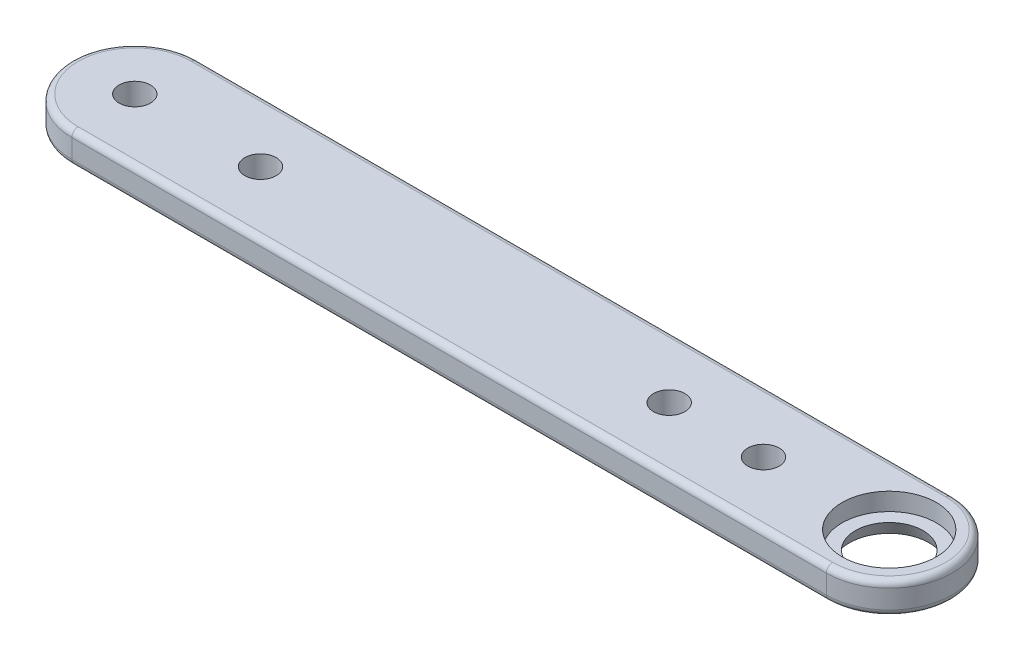
ISO-10303-21;
HEADER;
FILE_DESCRIPTION(('STEP AP214'),'2;1');
FILE_NAME('part.step','',(''),(''),'','','');
FILE_SCHEMA(('AUTOMOTIVE_DESIGN { 1 0 10303 214 1 1 1 1 }'));
ENDSEC;
DATA;
#1=APPLICATION_CONTEXT('core data for automotive mechanical design processes');
#2=APPLICATION_PROTOCOL_DEFINITION('international standard','automotive_design',2000,#1);
#3=PRODUCT_CONTEXT('',#1,'mechanical');
#4=PRODUCT('Part','Part','',(#3));
#5=PRODUCT_RELATED_PRODUCT_CATEGORY('part','',(#4));
#6=PRODUCT_DEFINITION_FORMATION('','',#4);
#7=PRODUCT_DEFINITION_CONTEXT('part definition',#1,'design');
#8=PRODUCT_DEFINITION('design','',#6,#7);
#9=PRODUCT_DEFINITION_SHAPE('','',#8);
#10=(LENGTH_UNIT() NAMED_UNIT(*) SI_UNIT(.MILLI.,.METRE.));
#11=(NAMED_UNIT(*) PLANE_ANGLE_UNIT() SI_UNIT($,.RADIAN.));
#12=(NAMED_UNIT(*) SI_UNIT($,.STERADIAN.) SOLID_ANGLE_UNIT());
#13=UNCERTAINTY_MEASURE_WITH_UNIT(LENGTH_MEASURE(1.E-05),#10,'distance_accuracy_value','');
#14=(GEOMETRIC_REPRESENTATION_CONTEXT(3) GLOBAL_UNCERTAINTY_ASSIGNED_CONTEXT((#13)) GLOBAL_UNIT_ASSIGNED_CONTEXT((#10,
#11,#12)) REPRESENTATION_CONTEXT('',''));
#15=CARTESIAN_POINT('',(0.,0.,0.));
#16=DIRECTION('',(0.,0.,1.));
#17=DIRECTION('',(1.,0.,0.));
#18=AXIS2_PLACEMENT_3D('',#15,#16,#17);
#19=CARTESIAN_POINT('',(0.,6.35,0.));
#20=DIRECTION('',(0.,1.,0.));
#21=DIRECTION('',(0.,0.,1.));
#22=AXIS2_PLACEMENT_3D('',#19,#20,#21);
#23=PLANE('',#22);
#24=CARTESIAN_POINT('',(76.2,6.35,0.));
#25=DIRECTION('',(0.,1.,0.));
#26=DIRECTION('',(0.,0.,1.));
#27=AXIS2_PLACEMENT_3D('',#24,#25,#26);
#28=CIRCLE('',#27,11.43);
#29=CARTESIAN_POINT('',(76.2,6.35,11.43));
#30=VERTEX_POINT('',#29);
#31=CARTESIAN_POINT('',(76.2,6.35,-11.43));
#32=VERTEX_POINT('',#31);
#33=EDGE_CURVE('E61',#30,#32,#28,.T.);
#34=ORIENTED_EDGE('',*,*,#33,.T.);
#35=DIRECTION('',(-1.,0.,0.));
#36=VECTOR('',#35,1.);
#37=CARTESIAN_POINT('',(-76.2,6.35,-11.43));
#38=LINE('',#37,#36);
#39=CARTESIAN_POINT('',(-76.2,6.35,-11.43));
#40=VERTEX_POINT('',#39);
#41=EDGE_CURVE('E56',#32,#40,#38,.T.);
#42=ORIENTED_EDGE('',*,*,#41,.T.);
#43=CARTESIAN_POINT('',(-76.2,6.35,0.));
#44=DIRECTION('',(0.,1.,0.));
#45=DIRECTION('',(0.,0.,1.));
#46=AXIS2_PLACEMENT_3D('',#43,#44,#45);
#47=CIRCLE('',#46,11.43);
#48=CARTESIAN_POINT('',(-76.2,6.35,11.43));
#49=VERTEX_POINT('',#48);
#50=EDGE_CURVE('E163',#40,#49,#47,.T.);
#51=ORIENTED_EDGE('',*,*,#50,.T.);
#52=DIRECTION('',(1.,0.,0.));
#53=VECTOR('',#52,1.);
#54=CARTESIAN_POINT('',(76.2,6.35,11.43));
#55=LINE('',#54,#53);
#56=EDGE_CURVE('E160',#49,#30,#55,.T.);
#57=ORIENTED_EDGE('',*,*,#56,.T.);
#58=EDGE_LOOP('',(#34,#42,#51,#57));
#59=FACE_BOUND('',#58,.T.);
#60=CARTESIAN_POINT('',(50.8,6.35,0.));
#61=DIRECTION('',(0.,1.,0.));
#62=DIRECTION('',(0.,0.,1.));
#63=AXIS2_PLACEMENT_3D('',#60,#61,#62);
#64=CIRCLE('',#63,3.175);
#65=CARTESIAN_POINT('',(50.8,6.35,3.17500000000002));
#66=VERTEX_POINT('',#65);
#67=EDGE_CURVE('E207',#66,#66,#64,.T.);
#68=ORIENTED_EDGE('',*,*,#67,.F.);
#69=EDGE_LOOP('',(#68));
#70=FACE_BOUND('',#69,.T.);
#71=CARTESIAN_POINT('',(31.75,6.35,0.));
#72=DIRECTION('',(0.,1.,0.));
#73=DIRECTION('',(0.,0.,1.));
#74=AXIS2_PLACEMENT_3D('',#71,#72,#73);
#75=CIRCLE('',#74,3.175);
#76=CARTESIAN_POINT('',(31.75,6.35,3.17500000000001));
#77=VERTEX_POINT('',#76);
#78=EDGE_CURVE('E201',#77,#77,#75,.T.);
#79=ORIENTED_EDGE('',*,*,#78,.F.);
#80=EDGE_LOOP('',(#79));
#81=FACE_BOUND('',#80,.T.);
#82=CARTESIAN_POINT('',(76.2,6.35,0.));
#83=DIRECTION('',(0.,1.,0.));
#84=DIRECTION('',(0.,0.,1.));
#85=AXIS2_PLACEMENT_3D('',#82,#83,#84);
#86=CIRCLE('',#85,9.52499999999999);
#87=CARTESIAN_POINT('',(76.2,6.35,9.52499999999999));
#88=VERTEX_POINT('',#87);
#89=EDGE_CURVE('E206',#88,#88,#86,.T.);
#90=ORIENTED_EDGE('',*,*,#89,.F.);
#91=EDGE_LOOP('',(#90));
#92=FACE_BOUND('',#91,.T.);
#93=CARTESIAN_POINT('',(-76.2,6.35,0.));
#94=DIRECTION('',(0.,1.,0.));
#95=DIRECTION('',(0.,0.,1.));
#96=AXIS2_PLACEMENT_3D('',#93,#94,#95);
#97=CIRCLE('',#96,3.175);
#98=CARTESIAN_POINT('',(-76.2,6.35,3.175));
#99=VERTEX_POINT('',#98);
#100=EDGE_CURVE('E223',#99,#99,#97,.T.);
#101=ORIENTED_EDGE('',*,*,#100,.F.);
#102=EDGE_LOOP('',(#101));
#103=FACE_BOUND('',#102,.T.);
#104=CARTESIAN_POINT('',(-50.8,6.35,0.));
#105=DIRECTION('',(0.,1.,0.));
#106=DIRECTION('',(0.,0.,1.));
#107=AXIS2_PLACEMENT_3D('',#104,#105,#106);
#108=CIRCLE('',#107,3.175);
#109=CARTESIAN_POINT('',(-50.8,6.35,3.175));
#110=VERTEX_POINT('',#109);
#111=EDGE_CURVE('E218',#110,#110,#108,.T.);
#112=ORIENTED_EDGE('',*,*,#111,.F.);
#113=EDGE_LOOP('',(#112));
#114=FACE_BOUND('',#113,.T.);
#115=ADVANCED_FACE('F39',(#59,#70,#81,#92,#103,#114),#23,.T.);
#116=CARTESIAN_POINT('',(0.,0.,0.));
#117=DIRECTION('',(0.,1.,0.));
#118=DIRECTION('',(0.,0.,1.));
#119=AXIS2_PLACEMENT_3D('',#116,#117,#118);
#120=PLANE('',#119);
#121=CARTESIAN_POINT('',(76.2,0.,0.));
#122=DIRECTION('',(0.,-1.,0.));
#123=DIRECTION('',(0.,0.,-1.));
#124=AXIS2_PLACEMENT_3D('',#121,#122,#123);
#125=CIRCLE('',#124,8.06821118956803);
#126=CARTESIAN_POINT('',(76.2,0.,-8.06821118956803));
#127=VERTEX_POINT('',#126);
#128=EDGE_CURVE('E417',#127,#127,#125,.T.);
#129=ORIENTED_EDGE('',*,*,#128,.F.);
#130=EDGE_LOOP('',(#129));
#131=FACE_BOUND('',#130,.T.);
#132=CARTESIAN_POINT('',(-76.2,0.,0.));
#133=DIRECTION('',(0.,1.,0.));
#134=DIRECTION('',(0.,0.,1.));
#135=AXIS2_PLACEMENT_3D('',#132,#133,#134);
#136=CIRCLE('',#135,11.43);
#137=CARTESIAN_POINT('',(-76.2,0.,11.43));
#138=VERTEX_POINT('',#137);
#139=CARTESIAN_POINT('',(-76.2,0.,-11.43));
#140=VERTEX_POINT('',#139);
#141=EDGE_CURVE('E153',#138,#140,#136,.F.);
#142=ORIENTED_EDGE('',*,*,#141,.T.);
#143=DIRECTION('',(-1.,0.,0.));
#144=VECTOR('',#143,1.);
#145=CARTESIAN_POINT('',(0.,0.,-11.43));
#146=LINE('',#145,#144);
#147=CARTESIAN_POINT('',(76.2,0.,-11.43));
#148=VERTEX_POINT('',#147);
#149=EDGE_CURVE('E134',#140,#148,#146,.F.);
#150=ORIENTED_EDGE('',*,*,#149,.T.);
#151=CARTESIAN_POINT('',(76.2,0.,0.));
#152=DIRECTION('',(0.,1.,0.));
#153=DIRECTION('',(0.,0.,1.));
#154=AXIS2_PLACEMENT_3D('',#151,#152,#153);
#155=CIRCLE('',#154,11.43);
#156=CARTESIAN_POINT('',(76.2,0.,11.43));
#157=VERTEX_POINT('',#156);
#158=EDGE_CURVE('E146',#148,#157,#155,.F.);
#159=ORIENTED_EDGE('',*,*,#158,.T.);
#160=DIRECTION('',(1.,0.,0.));
#161=VECTOR('',#160,1.);
#162=CARTESIAN_POINT('',(0.,0.,11.43));
#163=LINE('',#162,#161);
#164=EDGE_CURVE('E144',#157,#138,#163,.F.);
#165=ORIENTED_EDGE('',*,*,#164,.T.);
#166=EDGE_LOOP('',(#142,#150,#159,#165));
#167=FACE_BOUND('',#166,.T.);
#168=CARTESIAN_POINT('',(50.8,0.,0.));
#169=DIRECTION('',(0.,1.,0.));
#170=DIRECTION('',(0.,0.,1.));
#171=AXIS2_PLACEMENT_3D('',#168,#169,#170);
#172=CIRCLE('',#171,3.175);
#173=CARTESIAN_POINT('',(50.8,0.,3.17500000000002));
#174=VERTEX_POINT('',#173);
#175=EDGE_CURVE('E203',#174,#174,#172,.T.);
#176=ORIENTED_EDGE('',*,*,#175,.T.);
#177=EDGE_LOOP('',(#176));
#178=FACE_BOUND('',#177,.T.);
#179=CARTESIAN_POINT('',(31.75,0.,0.));
#180=DIRECTION('',(0.,1.,0.));
#181=DIRECTION('',(0.,0.,1.));
#182=AXIS2_PLACEMENT_3D('',#179,#180,#181);
#183=CIRCLE('',#182,3.175);
#184=CARTESIAN_POINT('',(31.75,0.,3.17500000000001));
#185=VERTEX_POINT('',#184);
#186=EDGE_CURVE('E210',#185,#185,#183,.T.);
#187=ORIENTED_EDGE('',*,*,#186,.T.);
#188=EDGE_LOOP('',(#187));
#189=FACE_BOUND('',#188,.T.);
#190=CARTESIAN_POINT('',(-76.2,0.,0.));
#191=DIRECTION('',(0.,1.,0.));
#192=DIRECTION('',(0.,0.,1.));
#193=AXIS2_PLACEMENT_3D('',#190,#191,#192);
#194=CIRCLE('',#193,3.175);
#195=CARTESIAN_POINT('',(-76.2,0.,3.175));
#196=VERTEX_POINT('',#195);
#197=EDGE_CURVE('E148',#196,#196,#194,.T.);
#198=ORIENTED_EDGE('',*,*,#197,.T.);
#199=EDGE_LOOP('',(#198));
#200=FACE_BOUND('',#199,.T.);
#201=CARTESIAN_POINT('',(-50.8,0.,0.));
#202=DIRECTION('',(0.,1.,0.));
#203=DIRECTION('',(0.,0.,1.));
#204=AXIS2_PLACEMENT_3D('',#201,#202,#203);
#205=CIRCLE('',#204,3.175);
#206=CARTESIAN_POINT('',(-50.8,0.,3.175));
#207=VERTEX_POINT('',#206);
#208=EDGE_CURVE('E226',#207,#207,#205,.T.);
#209=ORIENTED_EDGE('',*,*,#208,.T.);
#210=EDGE_LOOP('',(#209));
#211=FACE_BOUND('',#210,.T.);
#212=ADVANCED_FACE('F234',(#131,#167,#178,#189,#200,#211),#120,.F.);
#213=CARTESIAN_POINT('',(88.9,6.35,12.7));
#214=DIRECTION('',(0.,0.,-1.));
#215=DIRECTION('',(-1.,0.,0.));
#216=AXIS2_PLACEMENT_3D('',#213,#214,#215);
#217=PLANE('',#216);
#218=DIRECTION('',(0.,1.,0.));
#219=VECTOR('',#218,1.);
#220=CARTESIAN_POINT('',(-76.2,0.,12.7));
#221=LINE('',#220,#219);
#222=CARTESIAN_POINT('',(-76.2,1.27,12.7));
#223=VERTEX_POINT('',#222);
#224=CARTESIAN_POINT('',(-76.2,5.08,12.7));
#225=VERTEX_POINT('',#224);
#226=EDGE_CURVE('E195',#223,#225,#221,.T.);
#227=ORIENTED_EDGE('',*,*,#226,.F.);
#228=DIRECTION('',(1.,0.,0.));
#229=VECTOR('',#228,1.);
#230=CARTESIAN_POINT('',(88.9,1.27,12.7));
#231=LINE('',#230,#229);
#232=CARTESIAN_POINT('',(76.2,1.27,12.7));
#233=VERTEX_POINT('',#232);
#234=EDGE_CURVE('E12',#223,#233,#231,.T.);
#235=ORIENTED_EDGE('',*,*,#234,.T.);
#236=DIRECTION('',(0.,1.,0.));
#237=VECTOR('',#236,1.);
#238=CARTESIAN_POINT('',(76.2,0.,12.7));
#239=LINE('',#238,#237);
#240=CARTESIAN_POINT('',(76.2,5.08,12.7));
#241=VERTEX_POINT('',#240);
#242=EDGE_CURVE('E128',#233,#241,#239,.T.);
#243=ORIENTED_EDGE('',*,*,#242,.T.);
#244=DIRECTION('',(1.,0.,0.));
#245=VECTOR('',#244,1.);
#246=CARTESIAN_POINT('',(-76.2,5.08,12.7));
#247=LINE('',#246,#245);
#248=EDGE_CURVE('E48',#241,#225,#247,.F.);
#249=ORIENTED_EDGE('',*,*,#248,.T.);
#250=EDGE_LOOP('',(#227,#235,#243,#249));
#251=FACE_BOUND('',#250,.T.);
#252=ADVANCED_FACE('F194',(#251),#217,.F.);
#253=CARTESIAN_POINT('',(88.9,6.35,-12.7));
#254=DIRECTION('',(0.,0.,1.));
#255=DIRECTION('',(1.,0.,0.));
#256=AXIS2_PLACEMENT_3D('',#253,#254,#255);
#257=PLANE('',#256);
#258=DIRECTION('',(0.,1.,0.));
#259=VECTOR('',#258,1.);
#260=CARTESIAN_POINT('',(76.2,0.,-12.7));
#261=LINE('',#260,#259);
#262=CARTESIAN_POINT('',(76.2,1.27,-12.7));
#263=VERTEX_POINT('',#262);
#264=CARTESIAN_POINT('',(76.2,5.08,-12.7));
#265=VERTEX_POINT('',#264);
#266=EDGE_CURVE('E111',#263,#265,#261,.T.);
#267=ORIENTED_EDGE('',*,*,#266,.F.);
#268=DIRECTION('',(-1.,0.,0.));
#269=VECTOR('',#268,1.);
#270=CARTESIAN_POINT('',(88.9,1.27,-12.7));
#271=LINE('',#270,#269);
#272=CARTESIAN_POINT('',(-76.2,1.27,-12.7));
#273=VERTEX_POINT('',#272);
#274=EDGE_CURVE('E106',#263,#273,#271,.T.);
#275=ORIENTED_EDGE('',*,*,#274,.T.);
#276=DIRECTION('',(0.,1.,0.));
#277=VECTOR('',#276,1.);
#278=CARTESIAN_POINT('',(-76.2,0.,-12.7));
#279=LINE('',#278,#277);
#280=CARTESIAN_POINT('',(-76.2,5.08,-12.7));
#281=VERTEX_POINT('',#280);
#282=EDGE_CURVE('E109',#273,#281,#279,.T.);
#283=ORIENTED_EDGE('',*,*,#282,.T.);
#284=DIRECTION('',(-1.,0.,0.));
#285=VECTOR('',#284,1.);
#286=CARTESIAN_POINT('',(76.2,5.08,-12.7));
#287=LINE('',#286,#285);
#288=EDGE_CURVE('E116',#281,#265,#287,.F.);
#289=ORIENTED_EDGE('',*,*,#288,.T.);
#290=EDGE_LOOP('',(#267,#275,#283,#289));
#291=FACE_BOUND('',#290,.T.);
#292=ADVANCED_FACE('F108',(#291),#257,.F.);
#293=CARTESIAN_POINT('',(-50.8,0.,0.));
#294=DIRECTION('',(0.,1.,0.));
#295=DIRECTION('',(0.,0.,1.));
#296=AXIS2_PLACEMENT_3D('',#293,#294,#295);
#297=CYLINDRICAL_SURFACE('',#296,3.175);
#298=ORIENTED_EDGE('',*,*,#208,.F.);
#299=EDGE_LOOP('',(#298));
#300=FACE_BOUND('',#299,.T.);
#301=ORIENTED_EDGE('',*,*,#111,.T.);
#302=EDGE_LOOP('',(#301));
#303=FACE_BOUND('',#302,.T.);
#304=ADVANCED_FACE('F231',(#300,#303),#297,.F.);
#305=CARTESIAN_POINT('',(-76.2,0.,0.));
#306=DIRECTION('',(0.,1.,0.));
#307=DIRECTION('',(0.,0.,1.));
#308=AXIS2_PLACEMENT_3D('',#305,#306,#307);
#309=CYLINDRICAL_SURFACE('',#308,3.175);
#310=ORIENTED_EDGE('',*,*,#197,.F.);
#311=EDGE_LOOP('',(#310));
#312=FACE_BOUND('',#311,.T.);
#313=ORIENTED_EDGE('',*,*,#100,.T.);
#314=EDGE_LOOP('',(#313));
#315=FACE_BOUND('',#314,.T.);
#316=ADVANCED_FACE('F335',(#312,#315),#309,.F.);
#317=CARTESIAN_POINT('',(76.2,2.778125,0.));
#318=DIRECTION('',(0.,1.,0.));
#319=DIRECTION('',(0.,0.,1.));
#320=AXIS2_PLACEMENT_3D('',#317,#318,#319);
#321=PLANE('',#320);
#322=CARTESIAN_POINT('',(76.2,2.778125,0.));
#323=DIRECTION('',(0.,-1.,0.));
#324=DIRECTION('',(0.,0.,-1.));
#325=AXIS2_PLACEMENT_3D('',#322,#323,#324);
#326=CIRCLE('',#325,6.83131024819528);
#327=CARTESIAN_POINT('',(76.2,2.778125,-6.83131024819528));
#328=VERTEX_POINT('',#327);
#329=EDGE_CURVE('E175',#328,#328,#326,.T.);
#330=ORIENTED_EDGE('',*,*,#329,.T.);
#331=EDGE_LOOP('',(#330));
#332=FACE_BOUND('',#331,.T.);
#333=CARTESIAN_POINT('',(76.2,2.778125,0.));
#334=DIRECTION('',(0.,1.,0.));
#335=DIRECTION('',(0.,0.,1.));
#336=AXIS2_PLACEMENT_3D('',#333,#334,#335);
#337=CIRCLE('',#336,9.52499999999999);
#338=CARTESIAN_POINT('',(76.2,2.778125,9.52499999999999));
#339=VERTEX_POINT('',#338);
#340=EDGE_CURVE('E215',#339,#339,#337,.T.);
#341=ORIENTED_EDGE('',*,*,#340,.T.);
#342=EDGE_LOOP('',(#341));
#343=FACE_BOUND('',#342,.T.);
#344=ADVANCED_FACE('F326',(#332,#343),#321,.T.);
#345=CARTESIAN_POINT('',(76.2,2.778125,0.));
#346=DIRECTION('',(0.,1.,0.));
#347=DIRECTION('',(0.,0.,1.));
#348=AXIS2_PLACEMENT_3D('',#345,#346,#347);
#349=CYLINDRICAL_SURFACE('',#348,9.52499999999999);
#350=ORIENTED_EDGE('',*,*,#340,.F.);
#351=EDGE_LOOP('',(#350));
#352=FACE_BOUND('',#351,.T.);
#353=ORIENTED_EDGE('',*,*,#89,.T.);
#354=EDGE_LOOP('',(#353));
#355=FACE_BOUND('',#354,.T.);
#356=ADVANCED_FACE('F318',(#352,#355),#349,.F.);
#357=CARTESIAN_POINT('',(31.75,0.,0.));
#358=DIRECTION('',(0.,1.,0.));
#359=DIRECTION('',(0.,0.,1.));
#360=AXIS2_PLACEMENT_3D('',#357,#358,#359);
#361=CYLINDRICAL_SURFACE('',#360,3.175);
#362=ORIENTED_EDGE('',*,*,#186,.F.);
#363=EDGE_LOOP('',(#362));
#364=FACE_BOUND('',#363,.T.);
#365=ORIENTED_EDGE('',*,*,#78,.T.);
#366=EDGE_LOOP('',(#365));
#367=FACE_BOUND('',#366,.T.);
#368=ADVANCED_FACE('F310',(#364,#367),#361,.F.);
#369=CARTESIAN_POINT('',(50.8,0.,0.));
#370=DIRECTION('',(0.,1.,0.));
#371=DIRECTION('',(0.,0.,1.));
#372=AXIS2_PLACEMENT_3D('',#369,#370,#371);
#373=CYLINDRICAL_SURFACE('',#372,3.175);
#374=ORIENTED_EDGE('',*,*,#175,.F.);
#375=EDGE_LOOP('',(#374));
#376=FACE_BOUND('',#375,.T.);
#377=ORIENTED_EDGE('',*,*,#67,.T.);
#378=EDGE_LOOP('',(#377));
#379=FACE_BOUND('',#378,.T.);
#380=ADVANCED_FACE('F302',(#376,#379),#373,.F.);
#381=CARTESIAN_POINT('',(-76.2,0.,0.));
#382=DIRECTION('',(0.,1.,0.));
#383=DIRECTION('',(0.,0.,1.));
#384=AXIS2_PLACEMENT_3D('',#381,#382,#383);
#385=CYLINDRICAL_SURFACE('',#384,12.7);
#386=ORIENTED_EDGE('',*,*,#282,.F.);
#387=CARTESIAN_POINT('',(-76.2,1.27,0.));
#388=DIRECTION('',(0.,1.,0.));
#389=DIRECTION('',(0.,0.,1.));
#390=AXIS2_PLACEMENT_3D('',#387,#388,#389);
#391=CIRCLE('',#390,12.7);
#392=EDGE_CURVE('E124',#273,#223,#391,.T.);
#393=ORIENTED_EDGE('',*,*,#392,.T.);
#394=ORIENTED_EDGE('',*,*,#226,.T.);
#395=CARTESIAN_POINT('',(-76.2,5.08,0.));
#396=DIRECTION('',(0.,1.,0.));
#397=DIRECTION('',(0.,0.,1.));
#398=AXIS2_PLACEMENT_3D('',#395,#396,#397);
#399=CIRCLE('',#398,12.7);
#400=EDGE_CURVE('E127',#225,#281,#399,.F.);
#401=ORIENTED_EDGE('',*,*,#400,.T.);
#402=EDGE_LOOP('',(#386,#393,#394,#401));
#403=FACE_BOUND('',#402,.T.);
#404=ADVANCED_FACE('F121',(#403),#385,.T.);
#405=CARTESIAN_POINT('',(76.2,0.,0.));
#406=DIRECTION('',(0.,1.,0.));
#407=DIRECTION('',(0.,0.,1.));
#408=AXIS2_PLACEMENT_3D('',#405,#406,#407);
#409=CYLINDRICAL_SURFACE('',#408,12.7);
#410=ORIENTED_EDGE('',*,*,#242,.F.);
#411=CARTESIAN_POINT('',(76.2,1.27,0.));
#412=DIRECTION('',(0.,1.,0.));
#413=DIRECTION('',(0.,0.,1.));
#414=AXIS2_PLACEMENT_3D('',#411,#412,#413);
#415=CIRCLE('',#414,12.7);
#416=EDGE_CURVE('E158',#233,#263,#415,.T.);
#417=ORIENTED_EDGE('',*,*,#416,.T.);
#418=ORIENTED_EDGE('',*,*,#266,.T.);
#419=CARTESIAN_POINT('',(76.2,5.08,0.));
#420=DIRECTION('',(0.,1.,0.));
#421=DIRECTION('',(0.,0.,1.));
#422=AXIS2_PLACEMENT_3D('',#419,#420,#421);
#423=CIRCLE('',#422,12.7);
#424=EDGE_CURVE('E156',#265,#241,#423,.F.);
#425=ORIENTED_EDGE('',*,*,#424,.T.);
#426=EDGE_LOOP('',(#410,#417,#418,#425));
#427=FACE_BOUND('',#426,.T.);
#428=ADVANCED_FACE('F191',(#427),#409,.T.);
#429=CARTESIAN_POINT('',(76.2,1.27,0.));
#430=DIRECTION('',(0.,1.,0.));
#431=DIRECTION('',(0.,0.,1.));
#432=AXIS2_PLACEMENT_3D('',#429,#430,#431);
#433=TOROIDAL_SURFACE('',#432,11.43,1.27);
#434=CARTESIAN_POINT('',(76.2,1.27,11.43));
#435=DIRECTION('',(-1.,0.,0.));
#436=DIRECTION('',(0.,0.,1.));
#437=AXIS2_PLACEMENT_3D('',#434,#435,#436);
#438=CIRCLE('',#437,1.27);
#439=EDGE_CURVE('E138',#157,#233,#438,.T.);
#440=ORIENTED_EDGE('',*,*,#439,.F.);
#441=ORIENTED_EDGE('',*,*,#158,.F.);
#442=CARTESIAN_POINT('',(76.2,1.27,-11.43));
#443=DIRECTION('',(-1.,0.,0.));
#444=DIRECTION('',(0.,0.,1.));
#445=AXIS2_PLACEMENT_3D('',#442,#443,#444);
#446=CIRCLE('',#445,1.27);
#447=EDGE_CURVE('E129',#263,#148,#446,.T.);
#448=ORIENTED_EDGE('',*,*,#447,.F.);
#449=ORIENTED_EDGE('',*,*,#416,.F.);
#450=EDGE_LOOP('',(#440,#441,#448,#449));
#451=FACE_BOUND('',#450,.T.);
#452=ADVANCED_FACE('F257',(#451),#433,.T.);
#453=CARTESIAN_POINT('',(88.9,1.27,-11.43));
#454=DIRECTION('',(-1.,0.,0.));
#455=DIRECTION('',(0.,0.,1.));
#456=AXIS2_PLACEMENT_3D('',#453,#454,#455);
#457=CYLINDRICAL_SURFACE('',#456,1.27);
#458=ORIENTED_EDGE('',*,*,#447,.T.);
#459=ORIENTED_EDGE('',*,*,#149,.F.);
#460=CARTESIAN_POINT('',(-76.2,1.27,-11.43));
#461=DIRECTION('',(-1.,0.,0.));
#462=DIRECTION('',(0.,0.,1.));
#463=AXIS2_PLACEMENT_3D('',#460,#461,#462);
#464=CIRCLE('',#463,1.27);
#465=EDGE_CURVE('E132',#273,#140,#464,.T.);
#466=ORIENTED_EDGE('',*,*,#465,.F.);
#467=ORIENTED_EDGE('',*,*,#274,.F.);
#468=EDGE_LOOP('',(#458,#459,#466,#467));
#469=FACE_BOUND('',#468,.T.);
#470=ADVANCED_FACE('F133',(#469),#457,.T.);
#471=CARTESIAN_POINT('',(88.9,1.27,11.43));
#472=DIRECTION('',(1.,0.,0.));
#473=DIRECTION('',(0.,0.,-1.));
#474=AXIS2_PLACEMENT_3D('',#471,#472,#473);
#475=CYLINDRICAL_SURFACE('',#474,1.27);
#476=ORIENTED_EDGE('',*,*,#439,.T.);
#477=ORIENTED_EDGE('',*,*,#234,.F.);
#478=CARTESIAN_POINT('',(-76.2,1.27,11.43));
#479=DIRECTION('',(-1.,0.,0.));
#480=DIRECTION('',(0.,0.,1.));
#481=AXIS2_PLACEMENT_3D('',#478,#479,#480);
#482=CIRCLE('',#481,1.27);
#483=EDGE_CURVE('E139',#138,#223,#482,.T.);
#484=ORIENTED_EDGE('',*,*,#483,.F.);
#485=ORIENTED_EDGE('',*,*,#164,.F.);
#486=EDGE_LOOP('',(#476,#477,#484,#485));
#487=FACE_BOUND('',#486,.T.);
#488=ADVANCED_FACE('F251',(#487),#475,.T.);
#489=CARTESIAN_POINT('',(-76.2,1.27,0.));
#490=DIRECTION('',(0.,1.,0.));
#491=DIRECTION('',(0.,0.,1.));
#492=AXIS2_PLACEMENT_3D('',#489,#490,#491);
#493=TOROIDAL_SURFACE('',#492,11.43,1.27);
#494=ORIENTED_EDGE('',*,*,#465,.T.);
#495=ORIENTED_EDGE('',*,*,#141,.F.);
#496=ORIENTED_EDGE('',*,*,#483,.T.);
#497=ORIENTED_EDGE('',*,*,#392,.F.);
#498=EDGE_LOOP('',(#494,#495,#496,#497));
#499=FACE_BOUND('',#498,.T.);
#500=ADVANCED_FACE('F141',(#499),#493,.T.);
#501=CARTESIAN_POINT('',(76.2,5.08,0.));
#502=DIRECTION('',(0.,1.,0.));
#503=DIRECTION('',(0.,0.,1.));
#504=AXIS2_PLACEMENT_3D('',#501,#502,#503);
#505=TOROIDAL_SURFACE('',#504,11.43,1.27);
#506=CARTESIAN_POINT('',(76.2,5.08,11.43));
#507=DIRECTION('',(-1.,0.,0.));
#508=DIRECTION('',(0.,0.,1.));
#509=AXIS2_PLACEMENT_3D('',#506,#507,#508);
#510=CIRCLE('',#509,1.27);
#511=EDGE_CURVE('E176',#241,#30,#510,.T.);
#512=ORIENTED_EDGE('',*,*,#511,.F.);
#513=ORIENTED_EDGE('',*,*,#424,.F.);
#514=CARTESIAN_POINT('',(76.2,5.08,-11.43));
#515=DIRECTION('',(-1.,0.,0.));
#516=DIRECTION('',(0.,0.,1.));
#517=AXIS2_PLACEMENT_3D('',#514,#515,#516);
#518=CIRCLE('',#517,1.27);
#519=EDGE_CURVE('E43',#32,#265,#518,.T.);
#520=ORIENTED_EDGE('',*,*,#519,.F.);
#521=ORIENTED_EDGE('',*,*,#33,.F.);
#522=EDGE_LOOP('',(#512,#513,#520,#521));
#523=FACE_BOUND('',#522,.T.);
#524=ADVANCED_FACE('F41',(#523),#505,.T.);
#525=CARTESIAN_POINT('',(0.,5.08,-11.43));
#526=DIRECTION('',(1.,0.,0.));
#527=DIRECTION('',(0.,0.,-1.));
#528=AXIS2_PLACEMENT_3D('',#525,#526,#527);
#529=CYLINDRICAL_SURFACE('',#528,1.27);
#530=ORIENTED_EDGE('',*,*,#519,.T.);
#531=ORIENTED_EDGE('',*,*,#288,.F.);
#532=CARTESIAN_POINT('',(-76.2,5.08,-11.43));
#533=DIRECTION('',(-1.,0.,0.));
#534=DIRECTION('',(0.,0.,1.));
#535=AXIS2_PLACEMENT_3D('',#532,#533,#534);
#536=CIRCLE('',#535,1.27);
#537=EDGE_CURVE('E174',#40,#281,#536,.T.);
#538=ORIENTED_EDGE('',*,*,#537,.F.);
#539=ORIENTED_EDGE('',*,*,#41,.F.);
#540=EDGE_LOOP('',(#530,#531,#538,#539));
#541=FACE_BOUND('',#540,.T.);
#542=ADVANCED_FACE('F185',(#541),#529,.T.);
#543=CARTESIAN_POINT('',(0.,5.08,11.43));
#544=DIRECTION('',(-1.,0.,0.));
#545=DIRECTION('',(0.,0.,1.));
#546=AXIS2_PLACEMENT_3D('',#543,#544,#545);
#547=CYLINDRICAL_SURFACE('',#546,1.27);
#548=ORIENTED_EDGE('',*,*,#511,.T.);
#549=ORIENTED_EDGE('',*,*,#56,.F.);
#550=CARTESIAN_POINT('',(-76.2,5.08,11.43));
#551=DIRECTION('',(-1.,0.,0.));
#552=DIRECTION('',(0.,0.,1.));
#553=AXIS2_PLACEMENT_3D('',#550,#551,#552);
#554=CIRCLE('',#553,1.27);
#555=EDGE_CURVE('E172',#225,#49,#554,.T.);
#556=ORIENTED_EDGE('',*,*,#555,.F.);
#557=ORIENTED_EDGE('',*,*,#248,.F.);
#558=EDGE_LOOP('',(#548,#549,#556,#557));
#559=FACE_BOUND('',#558,.T.);
#560=ADVANCED_FACE('F265',(#559),#547,.T.);
#561=CARTESIAN_POINT('',(-76.2,5.08,0.));
#562=DIRECTION('',(0.,1.,0.));
#563=DIRECTION('',(0.,0.,1.));
#564=AXIS2_PLACEMENT_3D('',#561,#562,#563);
#565=TOROIDAL_SURFACE('',#564,11.43,1.27);
#566=ORIENTED_EDGE('',*,*,#537,.T.);
#567=ORIENTED_EDGE('',*,*,#400,.F.);
#568=ORIENTED_EDGE('',*,*,#555,.T.);
#569=ORIENTED_EDGE('',*,*,#50,.F.);
#570=EDGE_LOOP('',(#566,#567,#568,#569));
#571=FACE_BOUND('',#570,.T.);
#572=ADVANCED_FACE('F261',(#571),#565,.T.);
#573=CARTESIAN_POINT('',(76.2,0.,0.));
#574=DIRECTION('',(0.,-1.,0.));
#575=DIRECTION('',(0.,0.,-1.));
#576=AXIS2_PLACEMENT_3D('',#573,#574,#575);
#577=CONICAL_SURFACE('',#576,8.06821118956803,0.418879020478632);
#578=ORIENTED_EDGE('',*,*,#329,.F.);
#579=EDGE_LOOP('',(#578));
#580=FACE_BOUND('',#579,.T.);
#581=ORIENTED_EDGE('',*,*,#128,.T.);
#582=EDGE_LOOP('',(#581));
#583=FACE_BOUND('',#582,.T.);
#584=ADVANCED_FACE('F264',(#580,#583),#577,.F.);
#585=CLOSED_SHELL('',(#115,#212,#252,#292,#304,#316,#344,#356,#368,#380,#404,#428,#452,#470,
#488,#500,#524,#542,#560,#572,#584));
#586=MANIFOLD_SOLID_BREP('B2',#585);
#587=ADVANCED_BREP_SHAPE_REPRESENTATION('',(#18,#586),#14);
#588=SHAPE_DEFINITION_REPRESENTATION(#9,#587);
ENDSEC;
END-ISO-10303-21;
